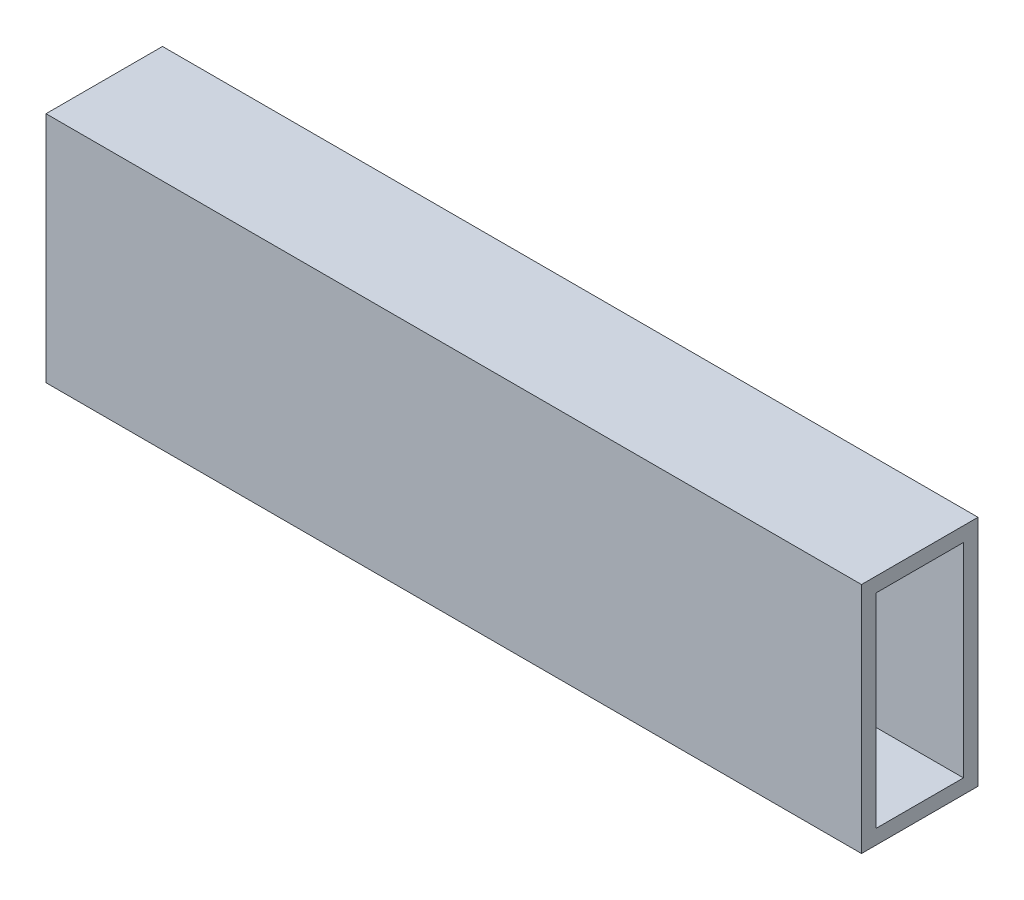
ISO-10303-21;
HEADER;
FILE_DESCRIPTION(('STEP AP214'),'2;1');
FILE_NAME('part.step','',(''),(''),'','','');
FILE_SCHEMA(('AUTOMOTIVE_DESIGN { 1 0 10303 214 1 1 1 1 }'));
ENDSEC;
DATA;
#1=APPLICATION_CONTEXT('core data for automotive mechanical design processes');
#2=APPLICATION_PROTOCOL_DEFINITION('international standard','automotive_design',2000,#1);
#3=PRODUCT_CONTEXT('',#1,'mechanical');
#4=PRODUCT('Part','Part','',(#3));
#5=PRODUCT_RELATED_PRODUCT_CATEGORY('part','',(#4));
#6=PRODUCT_DEFINITION_FORMATION('','',#4);
#7=PRODUCT_DEFINITION_CONTEXT('part definition',#1,'design');
#8=PRODUCT_DEFINITION('design','',#6,#7);
#9=PRODUCT_DEFINITION_SHAPE('','',#8);
#10=(LENGTH_UNIT() NAMED_UNIT(*) SI_UNIT(.MILLI.,.METRE.));
#11=(NAMED_UNIT(*) PLANE_ANGLE_UNIT() SI_UNIT($,.RADIAN.));
#12=(NAMED_UNIT(*) SI_UNIT($,.STERADIAN.) SOLID_ANGLE_UNIT());
#13=UNCERTAINTY_MEASURE_WITH_UNIT(LENGTH_MEASURE(1.E-05),#10,'distance_accuracy_value','');
#14=(GEOMETRIC_REPRESENTATION_CONTEXT(3) GLOBAL_UNCERTAINTY_ASSIGNED_CONTEXT((#13)) GLOBAL_UNIT_ASSIGNED_CONTEXT((#10,
#11,#12)) REPRESENTATION_CONTEXT('',''));
#15=CARTESIAN_POINT('',(0.,0.,0.));
#16=DIRECTION('',(0.,0.,1.));
#17=DIRECTION('',(1.,0.,0.));
#18=AXIS2_PLACEMENT_3D('',#15,#16,#17);
#19=CARTESIAN_POINT('',(0.,0.,25.4));
#20=DIRECTION('',(1.,0.,0.));
#21=DIRECTION('',(0.,0.,-1.));
#22=AXIS2_PLACEMENT_3D('',#19,#20,#21);
#23=PLANE('',#22);
#24=DIRECTION('',(0.,0.,-1.));
#25=VECTOR('',#24,1.);
#26=CARTESIAN_POINT('',(0.,-47.625,3.17499999999999));
#27=LINE('',#26,#25);
#28=CARTESIAN_POINT('',(0.,-47.625,22.225));
#29=VERTEX_POINT('',#28);
#30=CARTESIAN_POINT('',(0.,-47.625,3.17499999999999));
#31=VERTEX_POINT('',#30);
#32=EDGE_CURVE('E105',#29,#31,#27,.T.);
#33=ORIENTED_EDGE('',*,*,#32,.T.);
#34=DIRECTION('',(0.,1.,0.));
#35=VECTOR('',#34,1.);
#36=CARTESIAN_POINT('',(0.,-3.175,3.175));
#37=LINE('',#36,#35);
#38=CARTESIAN_POINT('',(0.,-3.175,3.175));
#39=VERTEX_POINT('',#38);
#40=EDGE_CURVE('E99',#31,#39,#37,.T.);
#41=ORIENTED_EDGE('',*,*,#40,.T.);
#42=DIRECTION('',(0.,0.,1.));
#43=VECTOR('',#42,1.);
#44=CARTESIAN_POINT('',(0.,-3.175,3.175));
#45=LINE('',#44,#43);
#46=CARTESIAN_POINT('',(0.,-3.175,22.225));
#47=VERTEX_POINT('',#46);
#48=EDGE_CURVE('E108',#39,#47,#45,.T.);
#49=ORIENTED_EDGE('',*,*,#48,.T.);
#50=DIRECTION('',(0.,-1.,0.));
#51=VECTOR('',#50,1.);
#52=CARTESIAN_POINT('',(0.,-3.175,22.225));
#53=LINE('',#52,#51);
#54=EDGE_CURVE('E47',#47,#29,#53,.T.);
#55=ORIENTED_EDGE('',*,*,#54,.T.);
#56=EDGE_LOOP('',(#33,#41,#49,#55));
#57=FACE_BOUND('',#56,.T.);
#58=DIRECTION('',(0.,-1.,0.));
#59=VECTOR('',#58,1.);
#60=CARTESIAN_POINT('',(0.,0.,0.));
#61=LINE('',#60,#59);
#62=CARTESIAN_POINT('',(0.,0.,0.));
#63=VERTEX_POINT('',#62);
#64=CARTESIAN_POINT('',(0.,-50.8,0.));
#65=VERTEX_POINT('',#64);
#66=EDGE_CURVE('E129',#63,#65,#61,.T.);
#67=ORIENTED_EDGE('',*,*,#66,.T.);
#68=DIRECTION('',(0.,0.,-1.));
#69=VECTOR('',#68,1.);
#70=CARTESIAN_POINT('',(0.,-50.8,25.4));
#71=LINE('',#70,#69);
#72=CARTESIAN_POINT('',(0.,-50.8,25.4));
#73=VERTEX_POINT('',#72);
#74=EDGE_CURVE('E11',#73,#65,#71,.T.);
#75=ORIENTED_EDGE('',*,*,#74,.F.);
#76=DIRECTION('',(0.,-1.,0.));
#77=VECTOR('',#76,1.);
#78=CARTESIAN_POINT('',(0.,0.,25.4));
#79=LINE('',#78,#77);
#80=CARTESIAN_POINT('',(0.,0.,25.4));
#81=VERTEX_POINT('',#80);
#82=EDGE_CURVE('E133',#81,#73,#79,.T.);
#83=ORIENTED_EDGE('',*,*,#82,.F.);
#84=DIRECTION('',(0.,0.,-1.));
#85=VECTOR('',#84,1.);
#86=CARTESIAN_POINT('',(0.,0.,25.4));
#87=LINE('',#86,#85);
#88=EDGE_CURVE('E143',#81,#63,#87,.T.);
#89=ORIENTED_EDGE('',*,*,#88,.T.);
#90=EDGE_LOOP('',(#67,#75,#83,#89));
#91=FACE_BOUND('',#90,.T.);
#92=ADVANCED_FACE('F33',(#57,#91),#23,.F.);
#93=CARTESIAN_POINT('',(0.,-50.8,25.4));
#94=DIRECTION('',(0.,1.,0.));
#95=DIRECTION('',(0.,0.,1.));
#96=AXIS2_PLACEMENT_3D('',#93,#94,#95);
#97=PLANE('',#96);
#98=DIRECTION('',(1.,0.,0.));
#99=VECTOR('',#98,1.);
#100=CARTESIAN_POINT('',(0.,-50.8,0.));
#101=LINE('',#100,#99);
#102=CARTESIAN_POINT('',(177.8,-50.8,0.));
#103=VERTEX_POINT('',#102);
#104=EDGE_CURVE('E146',#65,#103,#101,.T.);
#105=ORIENTED_EDGE('',*,*,#104,.T.);
#106=DIRECTION('',(0.,0.,-1.));
#107=VECTOR('',#106,1.);
#108=CARTESIAN_POINT('',(177.8,-50.8,25.4));
#109=LINE('',#108,#107);
#110=CARTESIAN_POINT('',(177.8,-50.8,25.4));
#111=VERTEX_POINT('',#110);
#112=EDGE_CURVE('E40',#111,#103,#109,.T.);
#113=ORIENTED_EDGE('',*,*,#112,.F.);
#114=DIRECTION('',(1.,0.,0.));
#115=VECTOR('',#114,1.);
#116=CARTESIAN_POINT('',(0.,-50.8,25.4));
#117=LINE('',#116,#115);
#118=EDGE_CURVE('E136',#73,#111,#117,.T.);
#119=ORIENTED_EDGE('',*,*,#118,.F.);
#120=ORIENTED_EDGE('',*,*,#74,.T.);
#121=EDGE_LOOP('',(#105,#113,#119,#120));
#122=FACE_BOUND('',#121,.T.);
#123=ADVANCED_FACE('F175',(#122),#97,.F.);
#124=CARTESIAN_POINT('',(177.8,0.,25.4));
#125=DIRECTION('',(-1.,0.,0.));
#126=DIRECTION('',(0.,0.,1.));
#127=AXIS2_PLACEMENT_3D('',#124,#125,#126);
#128=PLANE('',#127);
#129=DIRECTION('',(0.,0.,1.));
#130=VECTOR('',#129,1.);
#131=CARTESIAN_POINT('',(177.8,-3.175,3.175));
#132=LINE('',#131,#130);
#133=CARTESIAN_POINT('',(177.8,-3.175,3.175));
#134=VERTEX_POINT('',#133);
#135=CARTESIAN_POINT('',(177.8,-3.175,22.225));
#136=VERTEX_POINT('',#135);
#137=EDGE_CURVE('E123',#134,#136,#132,.T.);
#138=ORIENTED_EDGE('',*,*,#137,.F.);
#139=DIRECTION('',(0.,1.,0.));
#140=VECTOR('',#139,1.);
#141=CARTESIAN_POINT('',(177.8,-3.175,3.175));
#142=LINE('',#141,#140);
#143=CARTESIAN_POINT('',(177.8,-47.625,3.17499999999999));
#144=VERTEX_POINT('',#143);
#145=EDGE_CURVE('E55',#144,#134,#142,.T.);
#146=ORIENTED_EDGE('',*,*,#145,.F.);
#147=DIRECTION('',(0.,0.,-1.));
#148=VECTOR('',#147,1.);
#149=CARTESIAN_POINT('',(177.8,-47.625,3.17499999999999));
#150=LINE('',#149,#148);
#151=CARTESIAN_POINT('',(177.8,-47.625,22.225));
#152=VERTEX_POINT('',#151);
#153=EDGE_CURVE('E114',#152,#144,#150,.T.);
#154=ORIENTED_EDGE('',*,*,#153,.F.);
#155=DIRECTION('',(0.,-1.,0.));
#156=VECTOR('',#155,1.);
#157=CARTESIAN_POINT('',(177.8,-3.175,22.225));
#158=LINE('',#157,#156);
#159=EDGE_CURVE('E117',#136,#152,#158,.T.);
#160=ORIENTED_EDGE('',*,*,#159,.F.);
#161=EDGE_LOOP('',(#138,#146,#154,#160));
#162=FACE_BOUND('',#161,.T.);
#163=DIRECTION('',(0.,1.,0.));
#164=VECTOR('',#163,1.);
#165=CARTESIAN_POINT('',(177.8,0.,0.));
#166=LINE('',#165,#164);
#167=CARTESIAN_POINT('',(177.8,0.,0.));
#168=VERTEX_POINT('',#167);
#169=EDGE_CURVE('E148',#103,#168,#166,.T.);
#170=ORIENTED_EDGE('',*,*,#169,.T.);
#171=DIRECTION('',(0.,0.,-1.));
#172=VECTOR('',#171,1.);
#173=CARTESIAN_POINT('',(177.8,0.,25.4));
#174=LINE('',#173,#172);
#175=CARTESIAN_POINT('',(177.8,0.,25.4));
#176=VERTEX_POINT('',#175);
#177=EDGE_CURVE('E153',#176,#168,#174,.T.);
#178=ORIENTED_EDGE('',*,*,#177,.F.);
#179=DIRECTION('',(0.,1.,0.));
#180=VECTOR('',#179,1.);
#181=CARTESIAN_POINT('',(177.8,0.,25.4));
#182=LINE('',#181,#180);
#183=EDGE_CURVE('E139',#111,#176,#182,.T.);
#184=ORIENTED_EDGE('',*,*,#183,.F.);
#185=ORIENTED_EDGE('',*,*,#112,.T.);
#186=EDGE_LOOP('',(#170,#178,#184,#185));
#187=FACE_BOUND('',#186,.T.);
#188=ADVANCED_FACE('F160',(#162,#187),#128,.F.);
#189=CARTESIAN_POINT('',(0.,0.,25.4));
#190=DIRECTION('',(0.,-1.,0.));
#191=DIRECTION('',(0.,0.,-1.));
#192=AXIS2_PLACEMENT_3D('',#189,#190,#191);
#193=PLANE('',#192);
#194=DIRECTION('',(-1.,0.,0.));
#195=VECTOR('',#194,1.);
#196=CARTESIAN_POINT('',(0.,0.,0.));
#197=LINE('',#196,#195);
#198=EDGE_CURVE('E137',#168,#63,#197,.T.);
#199=ORIENTED_EDGE('',*,*,#198,.T.);
#200=ORIENTED_EDGE('',*,*,#88,.F.);
#201=DIRECTION('',(-1.,0.,0.));
#202=VECTOR('',#201,1.);
#203=CARTESIAN_POINT('',(0.,0.,25.4));
#204=LINE('',#203,#202);
#205=EDGE_CURVE('E141',#176,#81,#204,.T.);
#206=ORIENTED_EDGE('',*,*,#205,.F.);
#207=ORIENTED_EDGE('',*,*,#177,.T.);
#208=EDGE_LOOP('',(#199,#200,#206,#207));
#209=FACE_BOUND('',#208,.T.);
#210=ADVANCED_FACE('F169',(#209),#193,.F.);
#211=CARTESIAN_POINT('',(0.,0.,25.4));
#212=DIRECTION('',(0.,0.,1.));
#213=DIRECTION('',(1.,0.,0.));
#214=AXIS2_PLACEMENT_3D('',#211,#212,#213);
#215=PLANE('',#214);
#216=ORIENTED_EDGE('',*,*,#82,.T.);
#217=ORIENTED_EDGE('',*,*,#118,.T.);
#218=ORIENTED_EDGE('',*,*,#183,.T.);
#219=ORIENTED_EDGE('',*,*,#205,.T.);
#220=EDGE_LOOP('',(#216,#217,#218,#219));
#221=FACE_BOUND('',#220,.T.);
#222=ADVANCED_FACE('F174',(#221),#215,.T.);
#223=CARTESIAN_POINT('',(0.,0.,0.));
#224=DIRECTION('',(0.,0.,1.));
#225=DIRECTION('',(1.,0.,0.));
#226=AXIS2_PLACEMENT_3D('',#223,#224,#225);
#227=PLANE('',#226);
#228=ORIENTED_EDGE('',*,*,#66,.F.);
#229=ORIENTED_EDGE('',*,*,#198,.F.);
#230=ORIENTED_EDGE('',*,*,#169,.F.);
#231=ORIENTED_EDGE('',*,*,#104,.F.);
#232=EDGE_LOOP('',(#228,#229,#230,#231));
#233=FACE_BOUND('',#232,.T.);
#234=ADVANCED_FACE('F166',(#233),#227,.F.);
#235=CARTESIAN_POINT('',(0.,-3.175,3.175));
#236=DIRECTION('',(0.,0.,-1.));
#237=DIRECTION('',(0.,1.,0.));
#238=AXIS2_PLACEMENT_3D('',#235,#236,#237);
#239=PLANE('',#238);
#240=ORIENTED_EDGE('',*,*,#145,.T.);
#241=DIRECTION('',(1.,0.,0.));
#242=VECTOR('',#241,1.);
#243=CARTESIAN_POINT('',(0.,-3.175,3.175));
#244=LINE('',#243,#242);
#245=EDGE_CURVE('E95',#39,#134,#244,.T.);
#246=ORIENTED_EDGE('',*,*,#245,.F.);
#247=ORIENTED_EDGE('',*,*,#40,.F.);
#248=DIRECTION('',(1.,0.,0.));
#249=VECTOR('',#248,1.);
#250=CARTESIAN_POINT('',(0.,-47.625,3.17499999999999));
#251=LINE('',#250,#249);
#252=EDGE_CURVE('E127',#31,#144,#251,.T.);
#253=ORIENTED_EDGE('',*,*,#252,.T.);
#254=EDGE_LOOP('',(#240,#246,#247,#253));
#255=FACE_BOUND('',#254,.T.);
#256=ADVANCED_FACE('F97',(#255),#239,.F.);
#257=CARTESIAN_POINT('',(0.,-47.625,3.17499999999999));
#258=DIRECTION('',(0.,-1.,0.));
#259=DIRECTION('',(0.,0.,-1.));
#260=AXIS2_PLACEMENT_3D('',#257,#258,#259);
#261=PLANE('',#260);
#262=ORIENTED_EDGE('',*,*,#153,.T.);
#263=ORIENTED_EDGE('',*,*,#252,.F.);
#264=ORIENTED_EDGE('',*,*,#32,.F.);
#265=DIRECTION('',(1.,0.,0.));
#266=VECTOR('',#265,1.);
#267=CARTESIAN_POINT('',(0.,-47.625,22.225));
#268=LINE('',#267,#266);
#269=EDGE_CURVE('E130',#29,#152,#268,.T.);
#270=ORIENTED_EDGE('',*,*,#269,.T.);
#271=EDGE_LOOP('',(#262,#263,#264,#270));
#272=FACE_BOUND('',#271,.T.);
#273=ADVANCED_FACE('F192',(#272),#261,.F.);
#274=CARTESIAN_POINT('',(0.,-3.175,22.225));
#275=DIRECTION('',(0.,0.,1.));
#276=DIRECTION('',(0.,-1.,0.));
#277=AXIS2_PLACEMENT_3D('',#274,#275,#276);
#278=PLANE('',#277);
#279=ORIENTED_EDGE('',*,*,#159,.T.);
#280=ORIENTED_EDGE('',*,*,#269,.F.);
#281=ORIENTED_EDGE('',*,*,#54,.F.);
#282=DIRECTION('',(1.,0.,0.));
#283=VECTOR('',#282,1.);
#284=CARTESIAN_POINT('',(0.,-3.175,22.225));
#285=LINE('',#284,#283);
#286=EDGE_CURVE('E104',#47,#136,#285,.T.);
#287=ORIENTED_EDGE('',*,*,#286,.T.);
#288=EDGE_LOOP('',(#279,#280,#281,#287));
#289=FACE_BOUND('',#288,.T.);
#290=ADVANCED_FACE('F195',(#289),#278,.F.);
#291=CARTESIAN_POINT('',(0.,-3.175,3.175));
#292=DIRECTION('',(0.,1.,0.));
#293=DIRECTION('',(0.,0.,1.));
#294=AXIS2_PLACEMENT_3D('',#291,#292,#293);
#295=PLANE('',#294);
#296=ORIENTED_EDGE('',*,*,#137,.T.);
#297=ORIENTED_EDGE('',*,*,#286,.F.);
#298=ORIENTED_EDGE('',*,*,#48,.F.);
#299=ORIENTED_EDGE('',*,*,#245,.T.);
#300=EDGE_LOOP('',(#296,#297,#298,#299));
#301=FACE_BOUND('',#300,.T.);
#302=ADVANCED_FACE('F109',(#301),#295,.F.);
#303=CLOSED_SHELL('',(#92,#123,#188,#210,#222,#234,#256,#273,#290,#302));
#304=MANIFOLD_SOLID_BREP('B2',#303);
#305=ADVANCED_BREP_SHAPE_REPRESENTATION('',(#18,#304),#14);
#306=SHAPE_DEFINITION_REPRESENTATION(#9,#305);
ENDSEC;
END-ISO-10303-21;
